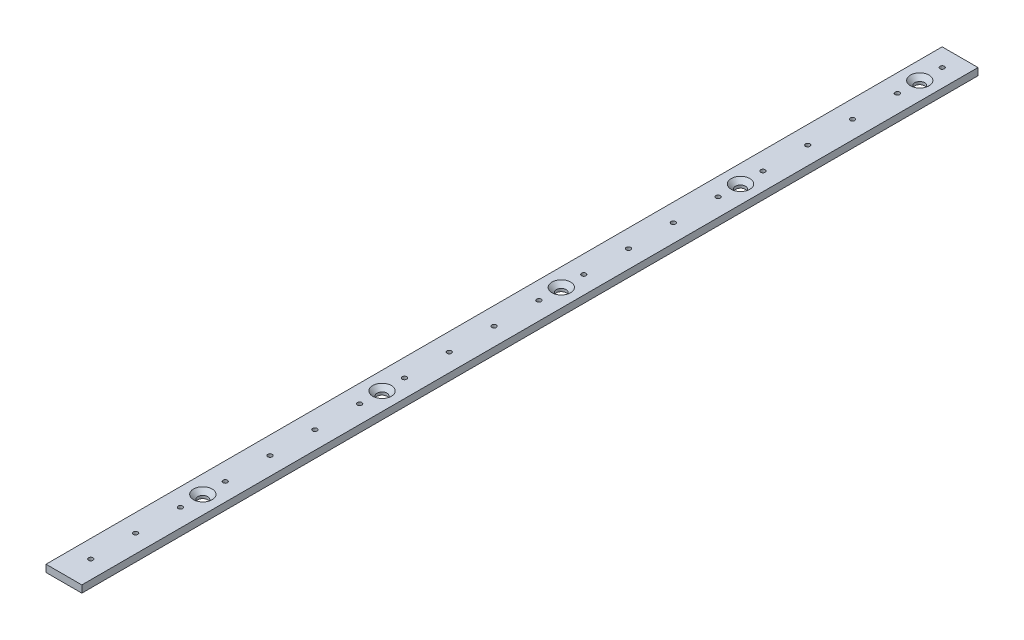
ISO-10303-21;
HEADER;
FILE_DESCRIPTION(('STEP AP214'),'2;1');
FILE_NAME('part.step','',(''),(''),'','','');
FILE_SCHEMA(('AUTOMOTIVE_DESIGN { 1 0 10303 214 1 1 1 1 }'));
ENDSEC;
DATA;
#1=APPLICATION_CONTEXT('core data for automotive mechanical design processes');
#2=APPLICATION_PROTOCOL_DEFINITION('international standard','automotive_design',2000,#1);
#3=PRODUCT_CONTEXT('',#1,'mechanical');
#4=PRODUCT('Part','Part','',(#3));
#5=PRODUCT_RELATED_PRODUCT_CATEGORY('part','',(#4));
#6=PRODUCT_DEFINITION_FORMATION('','',#4);
#7=PRODUCT_DEFINITION_CONTEXT('part definition',#1,'design');
#8=PRODUCT_DEFINITION('design','',#6,#7);
#9=PRODUCT_DEFINITION_SHAPE('','',#8);
#10=(LENGTH_UNIT() NAMED_UNIT(*) SI_UNIT(.MILLI.,.METRE.));
#11=(NAMED_UNIT(*) PLANE_ANGLE_UNIT() SI_UNIT($,.RADIAN.));
#12=(NAMED_UNIT(*) SI_UNIT($,.STERADIAN.) SOLID_ANGLE_UNIT());
#13=UNCERTAINTY_MEASURE_WITH_UNIT(LENGTH_MEASURE(1.E-05),#10,'distance_accuracy_value','');
#14=(GEOMETRIC_REPRESENTATION_CONTEXT(3) GLOBAL_UNCERTAINTY_ASSIGNED_CONTEXT((#13)) GLOBAL_UNIT_ASSIGNED_CONTEXT((#10,
#11,#12)) REPRESENTATION_CONTEXT('',''));
#15=CARTESIAN_POINT('',(0.,0.,0.));
#16=DIRECTION('',(0.,0.,1.));
#17=DIRECTION('',(1.,0.,0.));
#18=AXIS2_PLACEMENT_3D('',#15,#16,#17);
#19=CARTESIAN_POINT('',(0.,1.55,172.5));
#20=DIRECTION('',(0.,1.,0.));
#21=DIRECTION('',(0.,0.,1.));
#22=AXIS2_PLACEMENT_3D('',#19,#20,#21);
#23=CONICAL_SURFACE('',#22,2.75,0.785398163397);
#24=CARTESIAN_POINT('',(0.,4.,172.5));
#25=DIRECTION('',(0.,1.,0.));
#26=DIRECTION('',(0.,0.,1.));
#27=AXIS2_PLACEMENT_3D('',#24,#25,#26);
#28=CIRCLE('',#27,5.2);
#29=CARTESIAN_POINT('',(0.,4.,177.7));
#30=VERTEX_POINT('',#29);
#31=EDGE_CURVE('E123',#30,#30,#28,.T.);
#32=ORIENTED_EDGE('',*,*,#31,.T.);
#33=EDGE_LOOP('',(#32));
#34=FACE_BOUND('',#33,.T.);
#35=CARTESIAN_POINT('',(0.,1.55,172.5));
#36=DIRECTION('',(0.,1.,0.));
#37=DIRECTION('',(0.,0.,1.));
#38=AXIS2_PLACEMENT_3D('',#35,#36,#37);
#39=CIRCLE('',#38,2.75);
#40=CARTESIAN_POINT('',(0.,1.55,175.25));
#41=VERTEX_POINT('',#40);
#42=EDGE_CURVE('E10',#41,#41,#39,.T.);
#43=ORIENTED_EDGE('',*,*,#42,.F.);
#44=EDGE_LOOP('',(#43));
#45=FACE_BOUND('',#44,.T.);
#46=ADVANCED_FACE('F16',(#34,#45),#23,.F.);
#47=CARTESIAN_POINT('',(0.,1.55,72.5));
#48=DIRECTION('',(0.,1.,0.));
#49=DIRECTION('',(0.,0.,1.));
#50=AXIS2_PLACEMENT_3D('',#47,#48,#49);
#51=CONICAL_SURFACE('',#50,2.75,0.785398163397);
#52=CARTESIAN_POINT('',(0.,4.,72.5));
#53=DIRECTION('',(0.,1.,0.));
#54=DIRECTION('',(0.,0.,1.));
#55=AXIS2_PLACEMENT_3D('',#52,#53,#54);
#56=CIRCLE('',#55,5.2);
#57=CARTESIAN_POINT('',(0.,4.,77.7));
#58=VERTEX_POINT('',#57);
#59=EDGE_CURVE('E111',#58,#58,#56,.T.);
#60=ORIENTED_EDGE('',*,*,#59,.T.);
#61=EDGE_LOOP('',(#60));
#62=FACE_BOUND('',#61,.T.);
#63=CARTESIAN_POINT('',(0.,1.55,72.5));
#64=DIRECTION('',(0.,1.,0.));
#65=DIRECTION('',(0.,0.,1.));
#66=AXIS2_PLACEMENT_3D('',#63,#64,#65);
#67=CIRCLE('',#66,2.75);
#68=CARTESIAN_POINT('',(0.,1.55,75.25));
#69=VERTEX_POINT('',#68);
#70=EDGE_CURVE('E19',#69,#69,#67,.T.);
#71=ORIENTED_EDGE('',*,*,#70,.F.);
#72=EDGE_LOOP('',(#71));
#73=FACE_BOUND('',#72,.T.);
#74=ADVANCED_FACE('F338',(#62,#73),#51,.F.);
#75=CARTESIAN_POINT('',(0.,1.55,-27.5));
#76=DIRECTION('',(0.,1.,0.));
#77=DIRECTION('',(0.,0.,1.));
#78=AXIS2_PLACEMENT_3D('',#75,#76,#77);
#79=CONICAL_SURFACE('',#78,2.75,0.785398163397);
#80=CARTESIAN_POINT('',(0.,4.,-27.5));
#81=DIRECTION('',(0.,1.,0.));
#82=DIRECTION('',(0.,0.,1.));
#83=AXIS2_PLACEMENT_3D('',#80,#81,#82);
#84=CIRCLE('',#83,5.2);
#85=CARTESIAN_POINT('',(0.,4.,-22.3));
#86=VERTEX_POINT('',#85);
#87=EDGE_CURVE('E219',#86,#86,#84,.T.);
#88=ORIENTED_EDGE('',*,*,#87,.T.);
#89=EDGE_LOOP('',(#88));
#90=FACE_BOUND('',#89,.T.);
#91=CARTESIAN_POINT('',(0.,1.55,-27.5));
#92=DIRECTION('',(0.,1.,0.));
#93=DIRECTION('',(0.,0.,1.));
#94=AXIS2_PLACEMENT_3D('',#91,#92,#93);
#95=CIRCLE('',#94,2.75);
#96=CARTESIAN_POINT('',(0.,1.55,-24.75));
#97=VERTEX_POINT('',#96);
#98=EDGE_CURVE('E323',#97,#97,#95,.T.);
#99=ORIENTED_EDGE('',*,*,#98,.F.);
#100=EDGE_LOOP('',(#99));
#101=FACE_BOUND('',#100,.T.);
#102=ADVANCED_FACE('F340',(#90,#101),#79,.F.);
#103=CARTESIAN_POINT('',(0.,1.55,-127.5));
#104=DIRECTION('',(0.,1.,0.));
#105=DIRECTION('',(0.,0.,1.));
#106=AXIS2_PLACEMENT_3D('',#103,#104,#105);
#107=CONICAL_SURFACE('',#106,2.75,0.785398163397);
#108=CARTESIAN_POINT('',(0.,4.,-127.5));
#109=DIRECTION('',(0.,1.,0.));
#110=DIRECTION('',(0.,0.,1.));
#111=AXIS2_PLACEMENT_3D('',#108,#109,#110);
#112=CIRCLE('',#111,5.2);
#113=CARTESIAN_POINT('',(0.,4.,-122.3));
#114=VERTEX_POINT('',#113);
#115=EDGE_CURVE('E274',#114,#114,#112,.T.);
#116=ORIENTED_EDGE('',*,*,#115,.T.);
#117=EDGE_LOOP('',(#116));
#118=FACE_BOUND('',#117,.T.);
#119=CARTESIAN_POINT('',(0.,1.55,-127.5));
#120=DIRECTION('',(0.,1.,0.));
#121=DIRECTION('',(0.,0.,1.));
#122=AXIS2_PLACEMENT_3D('',#119,#120,#121);
#123=CIRCLE('',#122,2.75);
#124=CARTESIAN_POINT('',(0.,1.55,-124.75));
#125=VERTEX_POINT('',#124);
#126=EDGE_CURVE('E320',#125,#125,#123,.T.);
#127=ORIENTED_EDGE('',*,*,#126,.F.);
#128=EDGE_LOOP('',(#127));
#129=FACE_BOUND('',#128,.T.);
#130=ADVANCED_FACE('F348',(#118,#129),#107,.F.);
#131=CARTESIAN_POINT('',(0.,1.55,-227.5));
#132=DIRECTION('',(0.,1.,0.));
#133=DIRECTION('',(0.,0.,1.));
#134=AXIS2_PLACEMENT_3D('',#131,#132,#133);
#135=CONICAL_SURFACE('',#134,2.75,0.785398163397);
#136=CARTESIAN_POINT('',(0.,4.,-227.5));
#137=DIRECTION('',(0.,1.,0.));
#138=DIRECTION('',(0.,0.,1.));
#139=AXIS2_PLACEMENT_3D('',#136,#137,#138);
#140=CIRCLE('',#139,5.2);
#141=CARTESIAN_POINT('',(0.,4.,-222.3));
#142=VERTEX_POINT('',#141);
#143=EDGE_CURVE('E109',#142,#142,#140,.T.);
#144=ORIENTED_EDGE('',*,*,#143,.T.);
#145=EDGE_LOOP('',(#144));
#146=FACE_BOUND('',#145,.T.);
#147=CARTESIAN_POINT('',(0.,1.55,-227.5));
#148=DIRECTION('',(0.,1.,0.));
#149=DIRECTION('',(0.,0.,1.));
#150=AXIS2_PLACEMENT_3D('',#147,#148,#149);
#151=CIRCLE('',#150,2.75);
#152=CARTESIAN_POINT('',(0.,1.55,-224.75));
#153=VERTEX_POINT('',#152);
#154=EDGE_CURVE('E316',#153,#153,#151,.T.);
#155=ORIENTED_EDGE('',*,*,#154,.F.);
#156=EDGE_LOOP('',(#155));
#157=FACE_BOUND('',#156,.T.);
#158=ADVANCED_FACE('F466',(#146,#157),#135,.F.);
#159=CARTESIAN_POINT('',(0.,-1.,235.));
#160=DIRECTION('',(0.,1.,0.));
#161=DIRECTION('',(0.,0.,1.));
#162=AXIS2_PLACEMENT_3D('',#159,#160,#161);
#163=CYLINDRICAL_SURFACE('',#162,1.25);
#164=CARTESIAN_POINT('',(0.,4.,235.));
#165=DIRECTION('',(0.,1.,0.));
#166=DIRECTION('',(0.,0.,1.));
#167=AXIS2_PLACEMENT_3D('',#164,#165,#166);
#168=CIRCLE('',#167,1.25);
#169=CARTESIAN_POINT('',(0.,4.,236.25));
#170=VERTEX_POINT('',#169);
#171=EDGE_CURVE('E310',#170,#170,#168,.T.);
#172=ORIENTED_EDGE('',*,*,#171,.T.);
#173=EDGE_LOOP('',(#172));
#174=FACE_BOUND('',#173,.T.);
#175=CARTESIAN_POINT('',(0.,0.,235.));
#176=DIRECTION('',(0.,1.,0.));
#177=DIRECTION('',(0.,0.,1.));
#178=AXIS2_PLACEMENT_3D('',#175,#176,#177);
#179=CIRCLE('',#178,1.25);
#180=CARTESIAN_POINT('',(0.,0.,236.25));
#181=VERTEX_POINT('',#180);
#182=EDGE_CURVE('E142',#181,#181,#179,.T.);
#183=ORIENTED_EDGE('',*,*,#182,.F.);
#184=EDGE_LOOP('',(#183));
#185=FACE_BOUND('',#184,.T.);
#186=ADVANCED_FACE('F427',(#174,#185),#163,.F.);
#187=CARTESIAN_POINT('',(0.,-1.,210.));
#188=DIRECTION('',(0.,1.,0.));
#189=DIRECTION('',(0.,0.,1.));
#190=AXIS2_PLACEMENT_3D('',#187,#188,#189);
#191=CYLINDRICAL_SURFACE('',#190,1.25);
#192=CARTESIAN_POINT('',(0.,4.,210.));
#193=DIRECTION('',(0.,1.,0.));
#194=DIRECTION('',(0.,0.,1.));
#195=AXIS2_PLACEMENT_3D('',#192,#193,#194);
#196=CIRCLE('',#195,1.25);
#197=CARTESIAN_POINT('',(0.,4.,211.25));
#198=VERTEX_POINT('',#197);
#199=EDGE_CURVE('E306',#198,#198,#196,.T.);
#200=ORIENTED_EDGE('',*,*,#199,.T.);
#201=EDGE_LOOP('',(#200));
#202=FACE_BOUND('',#201,.T.);
#203=CARTESIAN_POINT('',(0.,0.,210.));
#204=DIRECTION('',(0.,1.,0.));
#205=DIRECTION('',(0.,0.,1.));
#206=AXIS2_PLACEMENT_3D('',#203,#204,#205);
#207=CIRCLE('',#206,1.25);
#208=CARTESIAN_POINT('',(0.,0.,211.25));
#209=VERTEX_POINT('',#208);
#210=EDGE_CURVE('E147',#209,#209,#207,.T.);
#211=ORIENTED_EDGE('',*,*,#210,.F.);
#212=EDGE_LOOP('',(#211));
#213=FACE_BOUND('',#212,.T.);
#214=ADVANCED_FACE('F416',(#202,#213),#191,.F.);
#215=CARTESIAN_POINT('',(0.,-1.,185.));
#216=DIRECTION('',(0.,1.,0.));
#217=DIRECTION('',(0.,0.,1.));
#218=AXIS2_PLACEMENT_3D('',#215,#216,#217);
#219=CYLINDRICAL_SURFACE('',#218,1.25);
#220=CARTESIAN_POINT('',(0.,4.,185.));
#221=DIRECTION('',(0.,1.,0.));
#222=DIRECTION('',(0.,0.,1.));
#223=AXIS2_PLACEMENT_3D('',#220,#221,#222);
#224=CIRCLE('',#223,1.25);
#225=CARTESIAN_POINT('',(0.,4.,186.25));
#226=VERTEX_POINT('',#225);
#227=EDGE_CURVE('E302',#226,#226,#224,.T.);
#228=ORIENTED_EDGE('',*,*,#227,.T.);
#229=EDGE_LOOP('',(#228));
#230=FACE_BOUND('',#229,.T.);
#231=CARTESIAN_POINT('',(0.,0.,185.));
#232=DIRECTION('',(0.,1.,0.));
#233=DIRECTION('',(0.,0.,1.));
#234=AXIS2_PLACEMENT_3D('',#231,#232,#233);
#235=CIRCLE('',#234,1.25);
#236=CARTESIAN_POINT('',(0.,0.,186.25));
#237=VERTEX_POINT('',#236);
#238=EDGE_CURVE('E232',#237,#237,#235,.T.);
#239=ORIENTED_EDGE('',*,*,#238,.F.);
#240=EDGE_LOOP('',(#239));
#241=FACE_BOUND('',#240,.T.);
#242=ADVANCED_FACE('F404',(#230,#241),#219,.F.);
#243=CARTESIAN_POINT('',(0.,-1.,172.5));
#244=DIRECTION('',(0.,1.,0.));
#245=DIRECTION('',(0.,0.,1.));
#246=AXIS2_PLACEMENT_3D('',#243,#244,#245);
#247=CYLINDRICAL_SURFACE('',#246,2.75);
#248=ORIENTED_EDGE('',*,*,#42,.T.);
#249=EDGE_LOOP('',(#248));
#250=FACE_BOUND('',#249,.T.);
#251=CARTESIAN_POINT('',(0.,0.,172.5));
#252=DIRECTION('',(0.,1.,0.));
#253=DIRECTION('',(0.,0.,1.));
#254=AXIS2_PLACEMENT_3D('',#251,#252,#253);
#255=CIRCLE('',#254,2.75);
#256=CARTESIAN_POINT('',(0.,0.,175.25));
#257=VERTEX_POINT('',#256);
#258=EDGE_CURVE('E228',#257,#257,#255,.T.);
#259=ORIENTED_EDGE('',*,*,#258,.F.);
#260=EDGE_LOOP('',(#259));
#261=FACE_BOUND('',#260,.T.);
#262=ADVANCED_FACE('F400',(#250,#261),#247,.F.);
#263=CARTESIAN_POINT('',(0.,-1.,160.));
#264=DIRECTION('',(0.,1.,0.));
#265=DIRECTION('',(0.,0.,1.));
#266=AXIS2_PLACEMENT_3D('',#263,#264,#265);
#267=CYLINDRICAL_SURFACE('',#266,1.25);
#268=CARTESIAN_POINT('',(0.,4.,160.));
#269=DIRECTION('',(0.,1.,0.));
#270=DIRECTION('',(0.,0.,1.));
#271=AXIS2_PLACEMENT_3D('',#268,#269,#270);
#272=CIRCLE('',#271,1.25);
#273=CARTESIAN_POINT('',(0.,4.,161.25));
#274=VERTEX_POINT('',#273);
#275=EDGE_CURVE('E119',#274,#274,#272,.T.);
#276=ORIENTED_EDGE('',*,*,#275,.T.);
#277=EDGE_LOOP('',(#276));
#278=FACE_BOUND('',#277,.T.);
#279=CARTESIAN_POINT('',(0.,0.,160.));
#280=DIRECTION('',(0.,1.,0.));
#281=DIRECTION('',(0.,0.,1.));
#282=AXIS2_PLACEMENT_3D('',#279,#280,#281);
#283=CIRCLE('',#282,1.25);
#284=CARTESIAN_POINT('',(0.,0.,161.25));
#285=VERTEX_POINT('',#284);
#286=EDGE_CURVE('E218',#285,#285,#283,.T.);
#287=ORIENTED_EDGE('',*,*,#286,.F.);
#288=EDGE_LOOP('',(#287));
#289=FACE_BOUND('',#288,.T.);
#290=ADVANCED_FACE('F403',(#278,#289),#267,.F.);
#291=CARTESIAN_POINT('',(0.,-1.,135.));
#292=DIRECTION('',(0.,1.,0.));
#293=DIRECTION('',(0.,0.,1.));
#294=AXIS2_PLACEMENT_3D('',#291,#292,#293);
#295=CYLINDRICAL_SURFACE('',#294,1.25);
#296=CARTESIAN_POINT('',(0.,4.,135.));
#297=DIRECTION('',(0.,1.,0.));
#298=DIRECTION('',(0.,0.,1.));
#299=AXIS2_PLACEMENT_3D('',#296,#297,#298);
#300=CIRCLE('',#299,1.25);
#301=CARTESIAN_POINT('',(0.,4.,136.25));
#302=VERTEX_POINT('',#301);
#303=EDGE_CURVE('E124',#302,#302,#300,.T.);
#304=ORIENTED_EDGE('',*,*,#303,.T.);
#305=EDGE_LOOP('',(#304));
#306=FACE_BOUND('',#305,.T.);
#307=CARTESIAN_POINT('',(0.,0.,135.));
#308=DIRECTION('',(0.,1.,0.));
#309=DIRECTION('',(0.,0.,1.));
#310=AXIS2_PLACEMENT_3D('',#307,#308,#309);
#311=CIRCLE('',#310,1.25);
#312=CARTESIAN_POINT('',(0.,0.,136.25));
#313=VERTEX_POINT('',#312);
#314=EDGE_CURVE('E214',#313,#313,#311,.T.);
#315=ORIENTED_EDGE('',*,*,#314,.F.);
#316=EDGE_LOOP('',(#315));
#317=FACE_BOUND('',#316,.T.);
#318=ADVANCED_FACE('F436',(#306,#317),#295,.F.);
#319=CARTESIAN_POINT('',(0.,-1.,110.));
#320=DIRECTION('',(0.,1.,0.));
#321=DIRECTION('',(0.,0.,1.));
#322=AXIS2_PLACEMENT_3D('',#319,#320,#321);
#323=CYLINDRICAL_SURFACE('',#322,1.25);
#324=CARTESIAN_POINT('',(0.,4.,110.));
#325=DIRECTION('',(0.,1.,0.));
#326=DIRECTION('',(0.,0.,1.));
#327=AXIS2_PLACEMENT_3D('',#324,#325,#326);
#328=CIRCLE('',#327,1.25);
#329=CARTESIAN_POINT('',(0.,4.,111.25));
#330=VERTEX_POINT('',#329);
#331=EDGE_CURVE('E251',#330,#330,#328,.T.);
#332=ORIENTED_EDGE('',*,*,#331,.T.);
#333=EDGE_LOOP('',(#332));
#334=FACE_BOUND('',#333,.T.);
#335=CARTESIAN_POINT('',(0.,0.,110.));
#336=DIRECTION('',(0.,1.,0.));
#337=DIRECTION('',(0.,0.,1.));
#338=AXIS2_PLACEMENT_3D('',#335,#336,#337);
#339=CIRCLE('',#338,1.25);
#340=CARTESIAN_POINT('',(0.,0.,111.25));
#341=VERTEX_POINT('',#340);
#342=EDGE_CURVE('E210',#341,#341,#339,.T.);
#343=ORIENTED_EDGE('',*,*,#342,.F.);
#344=EDGE_LOOP('',(#343));
#345=FACE_BOUND('',#344,.T.);
#346=ADVANCED_FACE('F439',(#334,#345),#323,.F.);
#347=CARTESIAN_POINT('',(0.,-1.,85.));
#348=DIRECTION('',(0.,1.,0.));
#349=DIRECTION('',(0.,0.,1.));
#350=AXIS2_PLACEMENT_3D('',#347,#348,#349);
#351=CYLINDRICAL_SURFACE('',#350,1.25);
#352=CARTESIAN_POINT('',(0.,4.,85.));
#353=DIRECTION('',(0.,1.,0.));
#354=DIRECTION('',(0.,0.,1.));
#355=AXIS2_PLACEMENT_3D('',#352,#353,#354);
#356=CIRCLE('',#355,1.25);
#357=CARTESIAN_POINT('',(0.,4.,86.25));
#358=VERTEX_POINT('',#357);
#359=EDGE_CURVE('E115',#358,#358,#356,.T.);
#360=ORIENTED_EDGE('',*,*,#359,.T.);
#361=EDGE_LOOP('',(#360));
#362=FACE_BOUND('',#361,.T.);
#363=CARTESIAN_POINT('',(0.,0.,85.));
#364=DIRECTION('',(0.,1.,0.));
#365=DIRECTION('',(0.,0.,1.));
#366=AXIS2_PLACEMENT_3D('',#363,#364,#365);
#367=CIRCLE('',#366,1.25);
#368=CARTESIAN_POINT('',(0.,0.,86.25));
#369=VERTEX_POINT('',#368);
#370=EDGE_CURVE('E206',#369,#369,#367,.T.);
#371=ORIENTED_EDGE('',*,*,#370,.F.);
#372=EDGE_LOOP('',(#371));
#373=FACE_BOUND('',#372,.T.);
#374=ADVANCED_FACE('F454',(#362,#373),#351,.F.);
#375=CARTESIAN_POINT('',(0.,-1.,72.5));
#376=DIRECTION('',(0.,1.,0.));
#377=DIRECTION('',(0.,0.,1.));
#378=AXIS2_PLACEMENT_3D('',#375,#376,#377);
#379=CYLINDRICAL_SURFACE('',#378,2.75);
#380=ORIENTED_EDGE('',*,*,#70,.T.);
#381=EDGE_LOOP('',(#380));
#382=FACE_BOUND('',#381,.T.);
#383=CARTESIAN_POINT('',(0.,0.,72.5));
#384=DIRECTION('',(0.,1.,0.));
#385=DIRECTION('',(0.,0.,1.));
#386=AXIS2_PLACEMENT_3D('',#383,#384,#385);
#387=CIRCLE('',#386,2.75);
#388=CARTESIAN_POINT('',(0.,0.,75.25));
#389=VERTEX_POINT('',#388);
#390=EDGE_CURVE('E202',#389,#389,#387,.T.);
#391=ORIENTED_EDGE('',*,*,#390,.F.);
#392=EDGE_LOOP('',(#391));
#393=FACE_BOUND('',#392,.T.);
#394=ADVANCED_FACE('F335',(#382,#393),#379,.F.);
#395=CARTESIAN_POINT('',(0.,-1.,60.));
#396=DIRECTION('',(0.,1.,0.));
#397=DIRECTION('',(0.,0.,1.));
#398=AXIS2_PLACEMENT_3D('',#395,#396,#397);
#399=CYLINDRICAL_SURFACE('',#398,1.25);
#400=CARTESIAN_POINT('',(0.,4.,60.));
#401=DIRECTION('',(0.,1.,0.));
#402=DIRECTION('',(0.,0.,1.));
#403=AXIS2_PLACEMENT_3D('',#400,#401,#402);
#404=CIRCLE('',#403,1.25);
#405=CARTESIAN_POINT('',(0.,4.,61.25));
#406=VERTEX_POINT('',#405);
#407=EDGE_CURVE('E116',#406,#406,#404,.T.);
#408=ORIENTED_EDGE('',*,*,#407,.T.);
#409=EDGE_LOOP('',(#408));
#410=FACE_BOUND('',#409,.T.);
#411=CARTESIAN_POINT('',(0.,0.,60.));
#412=DIRECTION('',(0.,1.,0.));
#413=DIRECTION('',(0.,0.,1.));
#414=AXIS2_PLACEMENT_3D('',#411,#412,#413);
#415=CIRCLE('',#414,1.25);
#416=CARTESIAN_POINT('',(0.,0.,61.25));
#417=VERTEX_POINT('',#416);
#418=EDGE_CURVE('E198',#417,#417,#415,.T.);
#419=ORIENTED_EDGE('',*,*,#418,.F.);
#420=EDGE_LOOP('',(#419));
#421=FACE_BOUND('',#420,.T.);
#422=ADVANCED_FACE('F447',(#410,#421),#399,.F.);
#423=CARTESIAN_POINT('',(0.,-1.,35.));
#424=DIRECTION('',(0.,1.,0.));
#425=DIRECTION('',(0.,0.,1.));
#426=AXIS2_PLACEMENT_3D('',#423,#424,#425);
#427=CYLINDRICAL_SURFACE('',#426,1.25);
#428=CARTESIAN_POINT('',(0.,4.,35.));
#429=DIRECTION('',(0.,1.,0.));
#430=DIRECTION('',(0.,0.,1.));
#431=AXIS2_PLACEMENT_3D('',#428,#429,#430);
#432=CIRCLE('',#431,1.25);
#433=CARTESIAN_POINT('',(0.,4.,36.25));
#434=VERTEX_POINT('',#433);
#435=EDGE_CURVE('E233',#434,#434,#432,.T.);
#436=ORIENTED_EDGE('',*,*,#435,.T.);
#437=EDGE_LOOP('',(#436));
#438=FACE_BOUND('',#437,.T.);
#439=CARTESIAN_POINT('',(0.,0.,35.));
#440=DIRECTION('',(0.,1.,0.));
#441=DIRECTION('',(0.,0.,1.));
#442=AXIS2_PLACEMENT_3D('',#439,#440,#441);
#443=CIRCLE('',#442,1.25);
#444=CARTESIAN_POINT('',(0.,0.,36.25));
#445=VERTEX_POINT('',#444);
#446=EDGE_CURVE('E194',#445,#445,#443,.T.);
#447=ORIENTED_EDGE('',*,*,#446,.F.);
#448=EDGE_LOOP('',(#447));
#449=FACE_BOUND('',#448,.T.);
#450=ADVANCED_FACE('F443',(#438,#449),#427,.F.);
#451=CARTESIAN_POINT('',(0.,-1.,10.));
#452=DIRECTION('',(0.,1.,0.));
#453=DIRECTION('',(0.,0.,1.));
#454=AXIS2_PLACEMENT_3D('',#451,#452,#453);
#455=CYLINDRICAL_SURFACE('',#454,1.25);
#456=CARTESIAN_POINT('',(0.,4.,10.));
#457=DIRECTION('',(0.,1.,0.));
#458=DIRECTION('',(0.,0.,1.));
#459=AXIS2_PLACEMENT_3D('',#456,#457,#458);
#460=CIRCLE('',#459,1.25);
#461=CARTESIAN_POINT('',(0.,4.,11.25));
#462=VERTEX_POINT('',#461);
#463=EDGE_CURVE('E106',#462,#462,#460,.T.);
#464=ORIENTED_EDGE('',*,*,#463,.T.);
#465=EDGE_LOOP('',(#464));
#466=FACE_BOUND('',#465,.T.);
#467=CARTESIAN_POINT('',(0.,0.,10.));
#468=DIRECTION('',(0.,1.,0.));
#469=DIRECTION('',(0.,0.,1.));
#470=AXIS2_PLACEMENT_3D('',#467,#468,#469);
#471=CIRCLE('',#470,1.25);
#472=CARTESIAN_POINT('',(0.,0.,11.25));
#473=VERTEX_POINT('',#472);
#474=EDGE_CURVE('E190',#473,#473,#471,.T.);
#475=ORIENTED_EDGE('',*,*,#474,.F.);
#476=EDGE_LOOP('',(#475));
#477=FACE_BOUND('',#476,.T.);
#478=ADVANCED_FACE('F434',(#466,#477),#455,.F.);
#479=CARTESIAN_POINT('',(0.,-1.,-15.));
#480=DIRECTION('',(0.,1.,0.));
#481=DIRECTION('',(0.,0.,1.));
#482=AXIS2_PLACEMENT_3D('',#479,#480,#481);
#483=CYLINDRICAL_SURFACE('',#482,1.25);
#484=CARTESIAN_POINT('',(0.,4.,-15.));
#485=DIRECTION('',(0.,1.,0.));
#486=DIRECTION('',(0.,0.,1.));
#487=AXIS2_PLACEMENT_3D('',#484,#485,#486);
#488=CIRCLE('',#487,1.25);
#489=CARTESIAN_POINT('',(0.,4.,-13.75));
#490=VERTEX_POINT('',#489);
#491=EDGE_CURVE('E223',#490,#490,#488,.T.);
#492=ORIENTED_EDGE('',*,*,#491,.T.);
#493=EDGE_LOOP('',(#492));
#494=FACE_BOUND('',#493,.T.);
#495=CARTESIAN_POINT('',(0.,0.,-15.));
#496=DIRECTION('',(0.,1.,0.));
#497=DIRECTION('',(0.,0.,1.));
#498=AXIS2_PLACEMENT_3D('',#495,#496,#497);
#499=CIRCLE('',#498,1.25);
#500=CARTESIAN_POINT('',(0.,0.,-13.75));
#501=VERTEX_POINT('',#500);
#502=EDGE_CURVE('E186',#501,#501,#499,.T.);
#503=ORIENTED_EDGE('',*,*,#502,.F.);
#504=EDGE_LOOP('',(#503));
#505=FACE_BOUND('',#504,.T.);
#506=ADVANCED_FACE('F431',(#494,#505),#483,.F.);
#507=CARTESIAN_POINT('',(0.,-1.,-27.5));
#508=DIRECTION('',(0.,1.,0.));
#509=DIRECTION('',(0.,0.,1.));
#510=AXIS2_PLACEMENT_3D('',#507,#508,#509);
#511=CYLINDRICAL_SURFACE('',#510,2.75);
#512=ORIENTED_EDGE('',*,*,#98,.T.);
#513=EDGE_LOOP('',(#512));
#514=FACE_BOUND('',#513,.T.);
#515=CARTESIAN_POINT('',(0.,0.,-27.5));
#516=DIRECTION('',(0.,1.,0.));
#517=DIRECTION('',(0.,0.,1.));
#518=AXIS2_PLACEMENT_3D('',#515,#516,#517);
#519=CIRCLE('',#518,2.75);
#520=CARTESIAN_POINT('',(0.,0.,-24.75));
#521=VERTEX_POINT('',#520);
#522=EDGE_CURVE('E182',#521,#521,#519,.T.);
#523=ORIENTED_EDGE('',*,*,#522,.F.);
#524=EDGE_LOOP('',(#523));
#525=FACE_BOUND('',#524,.T.);
#526=ADVANCED_FACE('F423',(#514,#525),#511,.F.);
#527=CARTESIAN_POINT('',(0.,-1.,-40.));
#528=DIRECTION('',(0.,1.,0.));
#529=DIRECTION('',(0.,0.,1.));
#530=AXIS2_PLACEMENT_3D('',#527,#528,#529);
#531=CYLINDRICAL_SURFACE('',#530,1.25);
#532=CARTESIAN_POINT('',(0.,4.,-40.));
#533=DIRECTION('',(0.,1.,0.));
#534=DIRECTION('',(0.,0.,1.));
#535=AXIS2_PLACEMENT_3D('',#532,#533,#534);
#536=CIRCLE('',#535,1.25);
#537=CARTESIAN_POINT('',(0.,4.,-38.75));
#538=VERTEX_POINT('',#537);
#539=EDGE_CURVE('E224',#538,#538,#536,.T.);
#540=ORIENTED_EDGE('',*,*,#539,.T.);
#541=EDGE_LOOP('',(#540));
#542=FACE_BOUND('',#541,.T.);
#543=CARTESIAN_POINT('',(0.,0.,-40.));
#544=DIRECTION('',(0.,1.,0.));
#545=DIRECTION('',(0.,0.,1.));
#546=AXIS2_PLACEMENT_3D('',#543,#544,#545);
#547=CIRCLE('',#546,1.25);
#548=CARTESIAN_POINT('',(0.,0.,-38.75));
#549=VERTEX_POINT('',#548);
#550=EDGE_CURVE('E178',#549,#549,#547,.T.);
#551=ORIENTED_EDGE('',*,*,#550,.F.);
#552=EDGE_LOOP('',(#551));
#553=FACE_BOUND('',#552,.T.);
#554=ADVANCED_FACE('F412',(#542,#553),#531,.F.);
#555=CARTESIAN_POINT('',(0.,-1.,-65.));
#556=DIRECTION('',(0.,1.,0.));
#557=DIRECTION('',(0.,0.,1.));
#558=AXIS2_PLACEMENT_3D('',#555,#556,#557);
#559=CYLINDRICAL_SURFACE('',#558,1.25);
#560=CARTESIAN_POINT('',(0.,4.,-65.));
#561=DIRECTION('',(0.,1.,0.));
#562=DIRECTION('',(0.,0.,1.));
#563=AXIS2_PLACEMENT_3D('',#560,#561,#562);
#564=CIRCLE('',#563,1.25);
#565=CARTESIAN_POINT('',(0.,4.,-63.75));
#566=VERTEX_POINT('',#565);
#567=EDGE_CURVE('E169',#566,#566,#564,.T.);
#568=ORIENTED_EDGE('',*,*,#567,.T.);
#569=EDGE_LOOP('',(#568));
#570=FACE_BOUND('',#569,.T.);
#571=CARTESIAN_POINT('',(0.,0.,-65.));
#572=DIRECTION('',(0.,1.,0.));
#573=DIRECTION('',(0.,0.,1.));
#574=AXIS2_PLACEMENT_3D('',#571,#572,#573);
#575=CIRCLE('',#574,1.25);
#576=CARTESIAN_POINT('',(0.,0.,-63.75));
#577=VERTEX_POINT('',#576);
#578=EDGE_CURVE('E174',#577,#577,#575,.T.);
#579=ORIENTED_EDGE('',*,*,#578,.F.);
#580=EDGE_LOOP('',(#579));
#581=FACE_BOUND('',#580,.T.);
#582=ADVANCED_FACE('F409',(#570,#581),#559,.F.);
#583=CARTESIAN_POINT('',(0.,-1.,-90.));
#584=DIRECTION('',(0.,1.,0.));
#585=DIRECTION('',(0.,0.,1.));
#586=AXIS2_PLACEMENT_3D('',#583,#584,#585);
#587=CYLINDRICAL_SURFACE('',#586,1.25);
#588=CARTESIAN_POINT('',(0.,4.,-90.));
#589=DIRECTION('',(0.,1.,0.));
#590=DIRECTION('',(0.,0.,1.));
#591=AXIS2_PLACEMENT_3D('',#588,#589,#590);
#592=CIRCLE('',#591,1.25);
#593=CARTESIAN_POINT('',(0.,4.,-88.75));
#594=VERTEX_POINT('',#593);
#595=EDGE_CURVE('E165',#594,#594,#592,.T.);
#596=ORIENTED_EDGE('',*,*,#595,.T.);
#597=EDGE_LOOP('',(#596));
#598=FACE_BOUND('',#597,.T.);
#599=CARTESIAN_POINT('',(0.,0.,-90.));
#600=DIRECTION('',(0.,1.,0.));
#601=DIRECTION('',(0.,0.,1.));
#602=AXIS2_PLACEMENT_3D('',#599,#600,#601);
#603=CIRCLE('',#602,1.25);
#604=CARTESIAN_POINT('',(0.,0.,-88.75));
#605=VERTEX_POINT('',#604);
#606=EDGE_CURVE('E164',#605,#605,#603,.T.);
#607=ORIENTED_EDGE('',*,*,#606,.F.);
#608=EDGE_LOOP('',(#607));
#609=FACE_BOUND('',#608,.T.);
#610=ADVANCED_FACE('F374',(#598,#609),#587,.F.);
#611=CARTESIAN_POINT('',(0.,-1.,-115.));
#612=DIRECTION('',(0.,1.,0.));
#613=DIRECTION('',(0.,0.,1.));
#614=AXIS2_PLACEMENT_3D('',#611,#612,#613);
#615=CYLINDRICAL_SURFACE('',#614,1.25);
#616=CARTESIAN_POINT('',(0.,4.,-115.));
#617=DIRECTION('',(0.,1.,0.));
#618=DIRECTION('',(0.,0.,1.));
#619=AXIS2_PLACEMENT_3D('',#616,#617,#618);
#620=CIRCLE('',#619,1.25);
#621=CARTESIAN_POINT('',(0.,4.,-113.75));
#622=VERTEX_POINT('',#621);
#623=EDGE_CURVE('E170',#622,#622,#620,.T.);
#624=ORIENTED_EDGE('',*,*,#623,.T.);
#625=EDGE_LOOP('',(#624));
#626=FACE_BOUND('',#625,.T.);
#627=CARTESIAN_POINT('',(0.,0.,-115.));
#628=DIRECTION('',(0.,1.,0.));
#629=DIRECTION('',(0.,0.,1.));
#630=AXIS2_PLACEMENT_3D('',#627,#628,#629);
#631=CIRCLE('',#630,1.25);
#632=CARTESIAN_POINT('',(0.,0.,-113.75));
#633=VERTEX_POINT('',#632);
#634=EDGE_CURVE('E156',#633,#633,#631,.T.);
#635=ORIENTED_EDGE('',*,*,#634,.F.);
#636=EDGE_LOOP('',(#635));
#637=FACE_BOUND('',#636,.T.);
#638=ADVANCED_FACE('F371',(#626,#637),#615,.F.);
#639=CARTESIAN_POINT('',(0.,-1.,-127.5));
#640=DIRECTION('',(0.,1.,0.));
#641=DIRECTION('',(0.,0.,1.));
#642=AXIS2_PLACEMENT_3D('',#639,#640,#641);
#643=CYLINDRICAL_SURFACE('',#642,2.75);
#644=ORIENTED_EDGE('',*,*,#126,.T.);
#645=EDGE_LOOP('',(#644));
#646=FACE_BOUND('',#645,.T.);
#647=CARTESIAN_POINT('',(0.,0.,-127.5));
#648=DIRECTION('',(0.,1.,0.));
#649=DIRECTION('',(0.,0.,1.));
#650=AXIS2_PLACEMENT_3D('',#647,#648,#649);
#651=CIRCLE('',#650,2.75);
#652=CARTESIAN_POINT('',(0.,0.,-124.75));
#653=VERTEX_POINT('',#652);
#654=EDGE_CURVE('E152',#653,#653,#651,.T.);
#655=ORIENTED_EDGE('',*,*,#654,.F.);
#656=EDGE_LOOP('',(#655));
#657=FACE_BOUND('',#656,.T.);
#658=ADVANCED_FACE('F367',(#646,#657),#643,.F.);
#659=CARTESIAN_POINT('',(0.,-1.,-140.));
#660=DIRECTION('',(0.,1.,0.));
#661=DIRECTION('',(0.,0.,1.));
#662=AXIS2_PLACEMENT_3D('',#659,#660,#661);
#663=CYLINDRICAL_SURFACE('',#662,1.25);
#664=CARTESIAN_POINT('',(0.,4.,-140.));
#665=DIRECTION('',(0.,1.,0.));
#666=DIRECTION('',(0.,0.,1.));
#667=AXIS2_PLACEMENT_3D('',#664,#665,#666);
#668=CIRCLE('',#667,1.25);
#669=CARTESIAN_POINT('',(0.,4.,-138.75));
#670=VERTEX_POINT('',#669);
#671=EDGE_CURVE('E270',#670,#670,#668,.T.);
#672=ORIENTED_EDGE('',*,*,#671,.T.);
#673=EDGE_LOOP('',(#672));
#674=FACE_BOUND('',#673,.T.);
#675=CARTESIAN_POINT('',(0.,0.,-140.));
#676=DIRECTION('',(0.,1.,0.));
#677=DIRECTION('',(0.,0.,1.));
#678=AXIS2_PLACEMENT_3D('',#675,#676,#677);
#679=CIRCLE('',#678,1.25);
#680=CARTESIAN_POINT('',(0.,0.,-138.75));
#681=VERTEX_POINT('',#680);
#682=EDGE_CURVE('E157',#681,#681,#679,.T.);
#683=ORIENTED_EDGE('',*,*,#682,.F.);
#684=EDGE_LOOP('',(#683));
#685=FACE_BOUND('',#684,.T.);
#686=ADVANCED_FACE('F363',(#674,#685),#663,.F.);
#687=CARTESIAN_POINT('',(0.,-1.,-165.));
#688=DIRECTION('',(0.,1.,0.));
#689=DIRECTION('',(0.,0.,1.));
#690=AXIS2_PLACEMENT_3D('',#687,#688,#689);
#691=CYLINDRICAL_SURFACE('',#690,1.25);
#692=CARTESIAN_POINT('',(0.,4.,-165.));
#693=DIRECTION('',(0.,1.,0.));
#694=DIRECTION('',(0.,0.,1.));
#695=AXIS2_PLACEMENT_3D('',#692,#693,#694);
#696=CIRCLE('',#695,1.25);
#697=CARTESIAN_POINT('',(0.,4.,-163.75));
#698=VERTEX_POINT('',#697);
#699=EDGE_CURVE('E266',#698,#698,#696,.T.);
#700=ORIENTED_EDGE('',*,*,#699,.T.);
#701=EDGE_LOOP('',(#700));
#702=FACE_BOUND('',#701,.T.);
#703=CARTESIAN_POINT('',(0.,0.,-165.));
#704=DIRECTION('',(0.,1.,0.));
#705=DIRECTION('',(0.,0.,1.));
#706=AXIS2_PLACEMENT_3D('',#703,#704,#705);
#707=CIRCLE('',#706,1.25);
#708=CARTESIAN_POINT('',(0.,0.,-163.75));
#709=VERTEX_POINT('',#708);
#710=EDGE_CURVE('E151',#709,#709,#707,.T.);
#711=ORIENTED_EDGE('',*,*,#710,.F.);
#712=EDGE_LOOP('',(#711));
#713=FACE_BOUND('',#712,.T.);
#714=ADVANCED_FACE('F366',(#702,#713),#691,.F.);
#715=CARTESIAN_POINT('',(0.,-1.,-190.));
#716=DIRECTION('',(0.,1.,0.));
#717=DIRECTION('',(0.,0.,1.));
#718=AXIS2_PLACEMENT_3D('',#715,#716,#717);
#719=CYLINDRICAL_SURFACE('',#718,1.25);
#720=CARTESIAN_POINT('',(0.,4.,-190.));
#721=DIRECTION('',(0.,1.,0.));
#722=DIRECTION('',(0.,0.,1.));
#723=AXIS2_PLACEMENT_3D('',#720,#721,#722);
#724=CIRCLE('',#723,1.25);
#725=CARTESIAN_POINT('',(0.,4.,-188.75));
#726=VERTEX_POINT('',#725);
#727=EDGE_CURVE('E262',#726,#726,#724,.T.);
#728=ORIENTED_EDGE('',*,*,#727,.T.);
#729=EDGE_LOOP('',(#728));
#730=FACE_BOUND('',#729,.T.);
#731=CARTESIAN_POINT('',(0.,0.,-190.));
#732=DIRECTION('',(0.,1.,0.));
#733=DIRECTION('',(0.,0.,1.));
#734=AXIS2_PLACEMENT_3D('',#731,#732,#733);
#735=CIRCLE('',#734,1.25);
#736=CARTESIAN_POINT('',(0.,0.,-188.75));
#737=VERTEX_POINT('',#736);
#738=EDGE_CURVE('E141',#737,#737,#735,.T.);
#739=ORIENTED_EDGE('',*,*,#738,.F.);
#740=EDGE_LOOP('',(#739));
#741=FACE_BOUND('',#740,.T.);
#742=ADVANCED_FACE('F378',(#730,#741),#719,.F.);
#743=CARTESIAN_POINT('',(0.,-1.,-215.));
#744=DIRECTION('',(0.,1.,0.));
#745=DIRECTION('',(0.,0.,1.));
#746=AXIS2_PLACEMENT_3D('',#743,#744,#745);
#747=CYLINDRICAL_SURFACE('',#746,1.25);
#748=CARTESIAN_POINT('',(0.,4.,-215.));
#749=DIRECTION('',(0.,1.,0.));
#750=DIRECTION('',(0.,0.,1.));
#751=AXIS2_PLACEMENT_3D('',#748,#749,#750);
#752=CIRCLE('',#751,1.25);
#753=CARTESIAN_POINT('',(0.,4.,-213.75));
#754=VERTEX_POINT('',#753);
#755=EDGE_CURVE('E258',#754,#754,#752,.T.);
#756=ORIENTED_EDGE('',*,*,#755,.T.);
#757=EDGE_LOOP('',(#756));
#758=FACE_BOUND('',#757,.T.);
#759=CARTESIAN_POINT('',(0.,0.,-215.));
#760=DIRECTION('',(0.,1.,0.));
#761=DIRECTION('',(0.,0.,1.));
#762=AXIS2_PLACEMENT_3D('',#759,#760,#761);
#763=CIRCLE('',#762,1.25);
#764=CARTESIAN_POINT('',(0.,0.,-213.75));
#765=VERTEX_POINT('',#764);
#766=EDGE_CURVE('E131',#765,#765,#763,.T.);
#767=ORIENTED_EDGE('',*,*,#766,.F.);
#768=EDGE_LOOP('',(#767));
#769=FACE_BOUND('',#768,.T.);
#770=ADVANCED_FACE('F386',(#758,#769),#747,.F.);
#771=CARTESIAN_POINT('',(0.,-1.,-227.5));
#772=DIRECTION('',(0.,1.,0.));
#773=DIRECTION('',(0.,0.,1.));
#774=AXIS2_PLACEMENT_3D('',#771,#772,#773);
#775=CYLINDRICAL_SURFACE('',#774,2.75);
#776=ORIENTED_EDGE('',*,*,#154,.T.);
#777=EDGE_LOOP('',(#776));
#778=FACE_BOUND('',#777,.T.);
#779=CARTESIAN_POINT('',(0.,0.,-227.5));
#780=DIRECTION('',(0.,1.,0.));
#781=DIRECTION('',(0.,0.,1.));
#782=AXIS2_PLACEMENT_3D('',#779,#780,#781);
#783=CIRCLE('',#782,2.75);
#784=CARTESIAN_POINT('',(0.,0.,-224.75));
#785=VERTEX_POINT('',#784);
#786=EDGE_CURVE('E127',#785,#785,#783,.T.);
#787=ORIENTED_EDGE('',*,*,#786,.F.);
#788=EDGE_LOOP('',(#787));
#789=FACE_BOUND('',#788,.T.);
#790=ADVANCED_FACE('F389',(#778,#789),#775,.F.);
#791=CARTESIAN_POINT('',(0.,-1.,-240.));
#792=DIRECTION('',(0.,1.,0.));
#793=DIRECTION('',(0.,0.,1.));
#794=AXIS2_PLACEMENT_3D('',#791,#792,#793);
#795=CYLINDRICAL_SURFACE('',#794,1.25);
#796=CARTESIAN_POINT('',(0.,4.,-240.));
#797=DIRECTION('',(0.,1.,0.));
#798=DIRECTION('',(0.,0.,1.));
#799=AXIS2_PLACEMENT_3D('',#796,#797,#798);
#800=CIRCLE('',#799,1.25);
#801=CARTESIAN_POINT('',(0.,4.,-238.75));
#802=VERTEX_POINT('',#801);
#803=EDGE_CURVE('E107',#802,#802,#800,.T.);
#804=ORIENTED_EDGE('',*,*,#803,.T.);
#805=EDGE_LOOP('',(#804));
#806=FACE_BOUND('',#805,.T.);
#807=CARTESIAN_POINT('',(0.,0.,-240.));
#808=DIRECTION('',(0.,1.,0.));
#809=DIRECTION('',(0.,0.,1.));
#810=AXIS2_PLACEMENT_3D('',#807,#808,#809);
#811=CIRCLE('',#810,1.25);
#812=CARTESIAN_POINT('',(0.,0.,-238.75));
#813=VERTEX_POINT('',#812);
#814=EDGE_CURVE('E132',#813,#813,#811,.T.);
#815=ORIENTED_EDGE('',*,*,#814,.F.);
#816=EDGE_LOOP('',(#815));
#817=FACE_BOUND('',#816,.T.);
#818=ADVANCED_FACE('F385',(#806,#817),#795,.F.);
#819=CARTESIAN_POINT('',(10.,0.,-250.));
#820=DIRECTION('',(1.,0.,0.));
#821=DIRECTION('',(0.,1.,0.));
#822=AXIS2_PLACEMENT_3D('',#819,#820,#821);
#823=PLANE('',#822);
#824=DIRECTION('',(0.,0.,1.));
#825=VECTOR('',#824,1.);
#826=CARTESIAN_POINT('',(10.,0.,-250.));
#827=LINE('',#826,#825);
#828=CARTESIAN_POINT('',(10.,0.,-250.));
#829=VERTEX_POINT('',#828);
#830=CARTESIAN_POINT('',(10.,0.,250.));
#831=VERTEX_POINT('',#830);
#832=EDGE_CURVE('E77',#829,#831,#827,.T.);
#833=ORIENTED_EDGE('',*,*,#832,.F.);
#834=DIRECTION('',(0.,1.,0.));
#835=VECTOR('',#834,1.);
#836=CARTESIAN_POINT('',(10.,0.,-250.));
#837=LINE('',#836,#835);
#838=CARTESIAN_POINT('',(10.,4.,-250.));
#839=VERTEX_POINT('',#838);
#840=EDGE_CURVE('E37',#829,#839,#837,.T.);
#841=ORIENTED_EDGE('',*,*,#840,.T.);
#842=DIRECTION('',(0.,0.,1.));
#843=VECTOR('',#842,1.);
#844=CARTESIAN_POINT('',(10.,4.,-250.));
#845=LINE('',#844,#843);
#846=CARTESIAN_POINT('',(10.,4.,250.));
#847=VERTEX_POINT('',#846);
#848=EDGE_CURVE('E43',#839,#847,#845,.T.);
#849=ORIENTED_EDGE('',*,*,#848,.T.);
#850=DIRECTION('',(0.,1.,0.));
#851=VECTOR('',#850,1.);
#852=CARTESIAN_POINT('',(10.,0.,250.));
#853=LINE('',#852,#851);
#854=EDGE_CURVE('E146',#831,#847,#853,.T.);
#855=ORIENTED_EDGE('',*,*,#854,.F.);
#856=EDGE_LOOP('',(#833,#841,#849,#855));
#857=FACE_BOUND('',#856,.T.);
#858=ADVANCED_FACE('F356',(#857),#823,.T.);
#859=CARTESIAN_POINT('',(-10.,0.,-250.));
#860=DIRECTION('',(0.,0.,1.));
#861=DIRECTION('',(1.,0.,0.));
#862=AXIS2_PLACEMENT_3D('',#859,#860,#861);
#863=PLANE('',#862);
#864=DIRECTION('',(1.,0.,0.));
#865=VECTOR('',#864,1.);
#866=CARTESIAN_POINT('',(-10.,4.,-250.));
#867=LINE('',#866,#865);
#868=CARTESIAN_POINT('',(-10.,4.,-250.));
#869=VERTEX_POINT('',#868);
#870=EDGE_CURVE('E247',#869,#839,#867,.T.);
#871=ORIENTED_EDGE('',*,*,#870,.T.);
#872=ORIENTED_EDGE('',*,*,#840,.F.);
#873=DIRECTION('',(1.,0.,0.));
#874=VECTOR('',#873,1.);
#875=CARTESIAN_POINT('',(-10.,0.,-250.));
#876=LINE('',#875,#874);
#877=CARTESIAN_POINT('',(-10.,0.,-250.));
#878=VERTEX_POINT('',#877);
#879=EDGE_CURVE('E82',#878,#829,#876,.T.);
#880=ORIENTED_EDGE('',*,*,#879,.F.);
#881=DIRECTION('',(0.,1.,0.));
#882=VECTOR('',#881,1.);
#883=CARTESIAN_POINT('',(-10.,0.,-250.));
#884=LINE('',#883,#882);
#885=EDGE_CURVE('E90',#878,#869,#884,.T.);
#886=ORIENTED_EDGE('',*,*,#885,.T.);
#887=EDGE_LOOP('',(#871,#872,#880,#886));
#888=FACE_BOUND('',#887,.T.);
#889=ADVANCED_FACE('F352',(#888),#863,.F.);
#890=CARTESIAN_POINT('',(-10.,4.,-250.));
#891=DIRECTION('',(0.,1.,0.));
#892=DIRECTION('',(1.,0.,0.));
#893=AXIS2_PLACEMENT_3D('',#890,#891,#892);
#894=PLANE('',#893);
#895=ORIENTED_EDGE('',*,*,#171,.F.);
#896=EDGE_LOOP('',(#895));
#897=FACE_BOUND('',#896,.T.);
#898=ORIENTED_EDGE('',*,*,#199,.F.);
#899=EDGE_LOOP('',(#898));
#900=FACE_BOUND('',#899,.T.);
#901=ORIENTED_EDGE('',*,*,#227,.F.);
#902=EDGE_LOOP('',(#901));
#903=FACE_BOUND('',#902,.T.);
#904=ORIENTED_EDGE('',*,*,#31,.F.);
#905=EDGE_LOOP('',(#904));
#906=FACE_BOUND('',#905,.T.);
#907=ORIENTED_EDGE('',*,*,#275,.F.);
#908=EDGE_LOOP('',(#907));
#909=FACE_BOUND('',#908,.T.);
#910=ORIENTED_EDGE('',*,*,#303,.F.);
#911=EDGE_LOOP('',(#910));
#912=FACE_BOUND('',#911,.T.);
#913=ORIENTED_EDGE('',*,*,#331,.F.);
#914=EDGE_LOOP('',(#913));
#915=FACE_BOUND('',#914,.T.);
#916=ORIENTED_EDGE('',*,*,#359,.F.);
#917=EDGE_LOOP('',(#916));
#918=FACE_BOUND('',#917,.T.);
#919=ORIENTED_EDGE('',*,*,#59,.F.);
#920=EDGE_LOOP('',(#919));
#921=FACE_BOUND('',#920,.T.);
#922=ORIENTED_EDGE('',*,*,#407,.F.);
#923=EDGE_LOOP('',(#922));
#924=FACE_BOUND('',#923,.T.);
#925=ORIENTED_EDGE('',*,*,#435,.F.);
#926=EDGE_LOOP('',(#925));
#927=FACE_BOUND('',#926,.T.);
#928=ORIENTED_EDGE('',*,*,#463,.F.);
#929=EDGE_LOOP('',(#928));
#930=FACE_BOUND('',#929,.T.);
#931=ORIENTED_EDGE('',*,*,#491,.F.);
#932=EDGE_LOOP('',(#931));
#933=FACE_BOUND('',#932,.T.);
#934=ORIENTED_EDGE('',*,*,#87,.F.);
#935=EDGE_LOOP('',(#934));
#936=FACE_BOUND('',#935,.T.);
#937=ORIENTED_EDGE('',*,*,#539,.F.);
#938=EDGE_LOOP('',(#937));
#939=FACE_BOUND('',#938,.T.);
#940=ORIENTED_EDGE('',*,*,#567,.F.);
#941=EDGE_LOOP('',(#940));
#942=FACE_BOUND('',#941,.T.);
#943=ORIENTED_EDGE('',*,*,#595,.F.);
#944=EDGE_LOOP('',(#943));
#945=FACE_BOUND('',#944,.T.);
#946=ORIENTED_EDGE('',*,*,#623,.F.);
#947=EDGE_LOOP('',(#946));
#948=FACE_BOUND('',#947,.T.);
#949=ORIENTED_EDGE('',*,*,#115,.F.);
#950=EDGE_LOOP('',(#949));
#951=FACE_BOUND('',#950,.T.);
#952=ORIENTED_EDGE('',*,*,#671,.F.);
#953=EDGE_LOOP('',(#952));
#954=FACE_BOUND('',#953,.T.);
#955=ORIENTED_EDGE('',*,*,#699,.F.);
#956=EDGE_LOOP('',(#955));
#957=FACE_BOUND('',#956,.T.);
#958=ORIENTED_EDGE('',*,*,#727,.F.);
#959=EDGE_LOOP('',(#958));
#960=FACE_BOUND('',#959,.T.);
#961=ORIENTED_EDGE('',*,*,#755,.F.);
#962=EDGE_LOOP('',(#961));
#963=FACE_BOUND('',#962,.T.);
#964=ORIENTED_EDGE('',*,*,#143,.F.);
#965=EDGE_LOOP('',(#964));
#966=FACE_BOUND('',#965,.T.);
#967=ORIENTED_EDGE('',*,*,#803,.F.);
#968=EDGE_LOOP('',(#967));
#969=FACE_BOUND('',#968,.T.);
#970=ORIENTED_EDGE('',*,*,#870,.F.);
#971=DIRECTION('',(0.,0.,1.));
#972=VECTOR('',#971,1.);
#973=CARTESIAN_POINT('',(-10.,4.,-250.));
#974=LINE('',#973,#972);
#975=CARTESIAN_POINT('',(-10.,4.,250.));
#976=VERTEX_POINT('',#975);
#977=EDGE_CURVE('E97',#869,#976,#974,.T.);
#978=ORIENTED_EDGE('',*,*,#977,.T.);
#979=DIRECTION('',(1.,0.,0.));
#980=VECTOR('',#979,1.);
#981=CARTESIAN_POINT('',(-10.,4.,250.));
#982=LINE('',#981,#980);
#983=EDGE_CURVE('E94',#976,#847,#982,.T.);
#984=ORIENTED_EDGE('',*,*,#983,.T.);
#985=ORIENTED_EDGE('',*,*,#848,.F.);
#986=EDGE_LOOP('',(#970,#978,#984,#985));
#987=FACE_BOUND('',#986,.T.);
#988=ADVANCED_FACE('F355',(#897,#900,#903,#906,#909,#912,#915,#918,#921,#924,#927,#930,#933,
#936,#939,#942,#945,#948,#951,#954,#957,#960,#963,#966,#969,#987),#894,.T.);
#989=CARTESIAN_POINT('',(-10.,0.,250.));
#990=DIRECTION('',(0.,0.,1.));
#991=DIRECTION('',(1.,0.,0.));
#992=AXIS2_PLACEMENT_3D('',#989,#990,#991);
#993=PLANE('',#992);
#994=DIRECTION('',(0.,1.,0.));
#995=VECTOR('',#994,1.);
#996=CARTESIAN_POINT('',(-10.,0.,250.));
#997=LINE('',#996,#995);
#998=CARTESIAN_POINT('',(-10.,0.,250.));
#999=VERTEX_POINT('',#998);
#1000=EDGE_CURVE('E88',#999,#976,#997,.T.);
#1001=ORIENTED_EDGE('',*,*,#1000,.F.);
#1002=DIRECTION('',(1.,0.,0.));
#1003=VECTOR('',#1002,1.);
#1004=CARTESIAN_POINT('',(-10.,0.,250.));
#1005=LINE('',#1004,#1003);
#1006=EDGE_CURVE('E71',#999,#831,#1005,.T.);
#1007=ORIENTED_EDGE('',*,*,#1006,.T.);
#1008=ORIENTED_EDGE('',*,*,#854,.T.);
#1009=ORIENTED_EDGE('',*,*,#983,.F.);
#1010=EDGE_LOOP('',(#1001,#1007,#1008,#1009));
#1011=FACE_BOUND('',#1010,.T.);
#1012=ADVANCED_FACE('F93',(#1011),#993,.T.);
#1013=CARTESIAN_POINT('',(-10.,0.,-250.));
#1014=DIRECTION('',(0.,1.,0.));
#1015=DIRECTION('',(1.,0.,0.));
#1016=AXIS2_PLACEMENT_3D('',#1013,#1014,#1015);
#1017=PLANE('',#1016);
#1018=ORIENTED_EDGE('',*,*,#182,.T.);
#1019=EDGE_LOOP('',(#1018));
#1020=FACE_BOUND('',#1019,.T.);
#1021=ORIENTED_EDGE('',*,*,#210,.T.);
#1022=EDGE_LOOP('',(#1021));
#1023=FACE_BOUND('',#1022,.T.);
#1024=ORIENTED_EDGE('',*,*,#238,.T.);
#1025=EDGE_LOOP('',(#1024));
#1026=FACE_BOUND('',#1025,.T.);
#1027=ORIENTED_EDGE('',*,*,#258,.T.);
#1028=EDGE_LOOP('',(#1027));
#1029=FACE_BOUND('',#1028,.T.);
#1030=ORIENTED_EDGE('',*,*,#286,.T.);
#1031=EDGE_LOOP('',(#1030));
#1032=FACE_BOUND('',#1031,.T.);
#1033=ORIENTED_EDGE('',*,*,#314,.T.);
#1034=EDGE_LOOP('',(#1033));
#1035=FACE_BOUND('',#1034,.T.);
#1036=ORIENTED_EDGE('',*,*,#342,.T.);
#1037=EDGE_LOOP('',(#1036));
#1038=FACE_BOUND('',#1037,.T.);
#1039=ORIENTED_EDGE('',*,*,#370,.T.);
#1040=EDGE_LOOP('',(#1039));
#1041=FACE_BOUND('',#1040,.T.);
#1042=ORIENTED_EDGE('',*,*,#390,.T.);
#1043=EDGE_LOOP('',(#1042));
#1044=FACE_BOUND('',#1043,.T.);
#1045=ORIENTED_EDGE('',*,*,#418,.T.);
#1046=EDGE_LOOP('',(#1045));
#1047=FACE_BOUND('',#1046,.T.);
#1048=ORIENTED_EDGE('',*,*,#446,.T.);
#1049=EDGE_LOOP('',(#1048));
#1050=FACE_BOUND('',#1049,.T.);
#1051=ORIENTED_EDGE('',*,*,#474,.T.);
#1052=EDGE_LOOP('',(#1051));
#1053=FACE_BOUND('',#1052,.T.);
#1054=ORIENTED_EDGE('',*,*,#502,.T.);
#1055=EDGE_LOOP('',(#1054));
#1056=FACE_BOUND('',#1055,.T.);
#1057=ORIENTED_EDGE('',*,*,#522,.T.);
#1058=EDGE_LOOP('',(#1057));
#1059=FACE_BOUND('',#1058,.T.);
#1060=ORIENTED_EDGE('',*,*,#550,.T.);
#1061=EDGE_LOOP('',(#1060));
#1062=FACE_BOUND('',#1061,.T.);
#1063=ORIENTED_EDGE('',*,*,#578,.T.);
#1064=EDGE_LOOP('',(#1063));
#1065=FACE_BOUND('',#1064,.T.);
#1066=ORIENTED_EDGE('',*,*,#606,.T.);
#1067=EDGE_LOOP('',(#1066));
#1068=FACE_BOUND('',#1067,.T.);
#1069=ORIENTED_EDGE('',*,*,#634,.T.);
#1070=EDGE_LOOP('',(#1069));
#1071=FACE_BOUND('',#1070,.T.);
#1072=ORIENTED_EDGE('',*,*,#654,.T.);
#1073=EDGE_LOOP('',(#1072));
#1074=FACE_BOUND('',#1073,.T.);
#1075=ORIENTED_EDGE('',*,*,#682,.T.);
#1076=EDGE_LOOP('',(#1075));
#1077=FACE_BOUND('',#1076,.T.);
#1078=ORIENTED_EDGE('',*,*,#710,.T.);
#1079=EDGE_LOOP('',(#1078));
#1080=FACE_BOUND('',#1079,.T.);
#1081=ORIENTED_EDGE('',*,*,#738,.T.);
#1082=EDGE_LOOP('',(#1081));
#1083=FACE_BOUND('',#1082,.T.);
#1084=ORIENTED_EDGE('',*,*,#766,.T.);
#1085=EDGE_LOOP('',(#1084));
#1086=FACE_BOUND('',#1085,.T.);
#1087=ORIENTED_EDGE('',*,*,#786,.T.);
#1088=EDGE_LOOP('',(#1087));
#1089=FACE_BOUND('',#1088,.T.);
#1090=ORIENTED_EDGE('',*,*,#814,.T.);
#1091=EDGE_LOOP('',(#1090));
#1092=FACE_BOUND('',#1091,.T.);
#1093=ORIENTED_EDGE('',*,*,#832,.T.);
#1094=ORIENTED_EDGE('',*,*,#1006,.F.);
#1095=DIRECTION('',(0.,0.,1.));
#1096=VECTOR('',#1095,1.);
#1097=CARTESIAN_POINT('',(-10.,0.,-250.));
#1098=LINE('',#1097,#1096);
#1099=EDGE_CURVE('E75',#878,#999,#1098,.T.);
#1100=ORIENTED_EDGE('',*,*,#1099,.F.);
#1101=ORIENTED_EDGE('',*,*,#879,.T.);
#1102=EDGE_LOOP('',(#1093,#1094,#1100,#1101));
#1103=FACE_BOUND('',#1102,.T.);
#1104=ADVANCED_FACE('F73',(#1020,#1023,#1026,#1029,#1032,#1035,#1038,#1041,#1044,#1047,#1050,
#1053,#1056,#1059,#1062,#1065,#1068,#1071,#1074,#1077,#1080,#1083,#1086,#1089,#1092,#1103),
#1017,.F.);
#1105=CARTESIAN_POINT('',(-10.,0.,-250.));
#1106=DIRECTION('',(1.,0.,0.));
#1107=DIRECTION('',(0.,1.,0.));
#1108=AXIS2_PLACEMENT_3D('',#1105,#1106,#1107);
#1109=PLANE('',#1108);
#1110=ORIENTED_EDGE('',*,*,#1000,.T.);
#1111=ORIENTED_EDGE('',*,*,#977,.F.);
#1112=ORIENTED_EDGE('',*,*,#885,.F.);
#1113=ORIENTED_EDGE('',*,*,#1099,.T.);
#1114=EDGE_LOOP('',(#1110,#1111,#1112,#1113));
#1115=FACE_BOUND('',#1114,.T.);
#1116=ADVANCED_FACE('F86',(#1115),#1109,.F.);
#1117=CLOSED_SHELL('',(#46,#74,#102,#130,#158,#186,#214,#242,#262,#290,#318,#346,#374,#394,#422,
#450,#478,#506,#526,#554,#582,#610,#638,#658,#686,#714,#742,#770,#790,#818,#858,#889,#988,#1012,
#1104,#1116));
#1118=MANIFOLD_SOLID_BREP('B1',#1117);
#1119=ADVANCED_BREP_SHAPE_REPRESENTATION('',(#18,#1118),#14);
#1120=SHAPE_DEFINITION_REPRESENTATION(#9,#1119);
ENDSEC;
END-ISO-10303-21;
